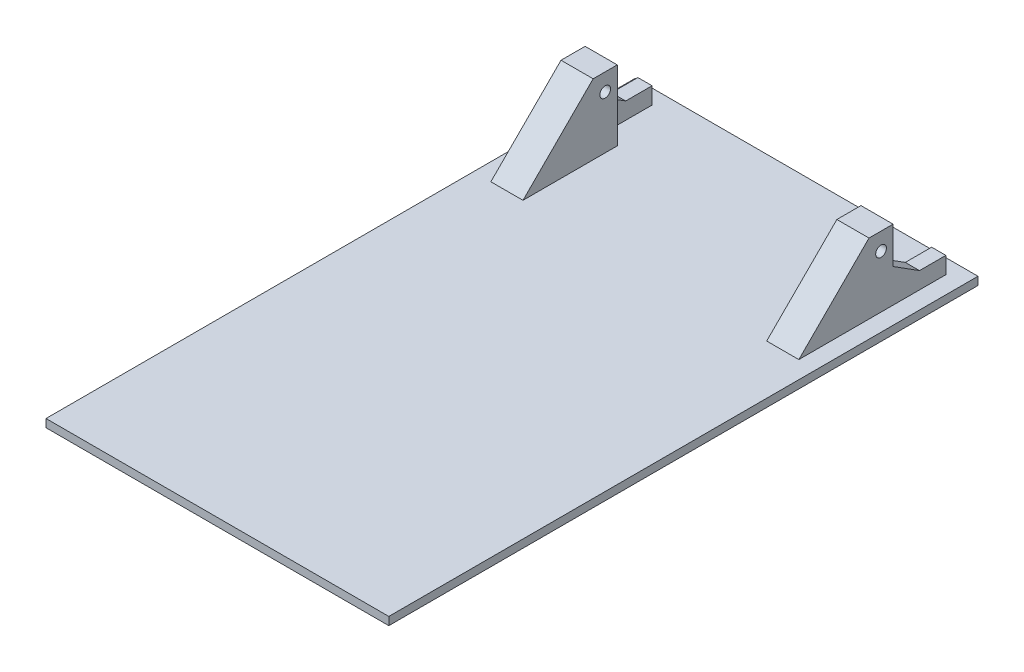
ISO-10303-21;
HEADER;
FILE_DESCRIPTION(('STEP AP214'),'2;1');
FILE_NAME('part.step','',(''),(''),'','','');
FILE_SCHEMA(('AUTOMOTIVE_DESIGN { 1 0 10303 214 1 1 1 1 }'));
ENDSEC;
DATA;
#1=APPLICATION_CONTEXT('core data for automotive mechanical design processes');
#2=APPLICATION_PROTOCOL_DEFINITION('international standard','automotive_design',2000,#1);
#3=PRODUCT_CONTEXT('',#1,'mechanical');
#4=PRODUCT('Part','Part','',(#3));
#5=PRODUCT_RELATED_PRODUCT_CATEGORY('part','',(#4));
#6=PRODUCT_DEFINITION_FORMATION('','',#4);
#7=PRODUCT_DEFINITION_CONTEXT('part definition',#1,'design');
#8=PRODUCT_DEFINITION('design','',#6,#7);
#9=PRODUCT_DEFINITION_SHAPE('','',#8);
#10=(LENGTH_UNIT() NAMED_UNIT(*) SI_UNIT(.MILLI.,.METRE.));
#11=(NAMED_UNIT(*) PLANE_ANGLE_UNIT() SI_UNIT($,.RADIAN.));
#12=(NAMED_UNIT(*) SI_UNIT($,.STERADIAN.) SOLID_ANGLE_UNIT());
#13=UNCERTAINTY_MEASURE_WITH_UNIT(LENGTH_MEASURE(1.E-05),#10,'distance_accuracy_value','');
#14=(GEOMETRIC_REPRESENTATION_CONTEXT(3) GLOBAL_UNCERTAINTY_ASSIGNED_CONTEXT((#13)) GLOBAL_UNIT_ASSIGNED_CONTEXT((#10,
#11,#12)) REPRESENTATION_CONTEXT('',''));
#15=CARTESIAN_POINT('',(0.,0.,0.));
#16=DIRECTION('',(0.,0.,1.));
#17=DIRECTION('',(1.,0.,0.));
#18=AXIS2_PLACEMENT_3D('',#15,#16,#17);
#19=CARTESIAN_POINT('',(0.,1.5,0.));
#20=DIRECTION('',(0.,1.,0.));
#21=DIRECTION('',(0.,0.,1.));
#22=AXIS2_PLACEMENT_3D('',#19,#20,#21);
#23=PLANE('',#22);
#24=DIRECTION('',(1.,0.,0.));
#25=VECTOR('',#24,1.);
#26=CARTESIAN_POINT('',(26.1,1.5,-24.7999999999997));
#27=LINE('',#26,#25);
#28=CARTESIAN_POINT('',(22.75,1.5,-24.7999999999997));
#29=VERTEX_POINT('',#28);
#30=CARTESIAN_POINT('',(28.75,1.5,-24.7999999999997));
#31=VERTEX_POINT('',#30);
#32=EDGE_CURVE('E223',#29,#31,#27,.T.);
#33=ORIENTED_EDGE('',*,*,#32,.F.);
#34=DIRECTION('',(0.,0.,-1.));
#35=VECTOR('',#34,1.);
#36=CARTESIAN_POINT('',(22.75,1.5,-37.9));
#37=LINE('',#36,#35);
#38=CARTESIAN_POINT('',(22.75,1.5,-42.4));
#39=VERTEX_POINT('',#38);
#40=EDGE_CURVE('E60',#29,#39,#37,.T.);
#41=ORIENTED_EDGE('',*,*,#40,.T.);
#42=DIRECTION('',(1.,0.,0.));
#43=VECTOR('',#42,1.);
#44=CARTESIAN_POINT('',(28.75,1.5,-42.4));
#45=LINE('',#44,#43);
#46=CARTESIAN_POINT('',(26.1,1.5,-42.4));
#47=VERTEX_POINT('',#46);
#48=EDGE_CURVE('E263',#39,#47,#45,.T.);
#49=ORIENTED_EDGE('',*,*,#48,.T.);
#50=DIRECTION('',(0.,0.,1.));
#51=VECTOR('',#50,1.);
#52=CARTESIAN_POINT('',(26.1000000000001,1.5,-52.2499999999998));
#53=LINE('',#52,#51);
#54=CARTESIAN_POINT('',(26.1000000000001,1.5,-52.2499999999998));
#55=VERTEX_POINT('',#54);
#56=EDGE_CURVE('E68',#55,#47,#53,.T.);
#57=ORIENTED_EDGE('',*,*,#56,.F.);
#58=DIRECTION('',(1.,0.,0.));
#59=VECTOR('',#58,1.);
#60=CARTESIAN_POINT('',(26.1000000000001,1.5,-52.2499999999998));
#61=LINE('',#60,#59);
#62=CARTESIAN_POINT('',(28.7500000000001,1.5,-52.2499999999998));
#63=VERTEX_POINT('',#62);
#64=EDGE_CURVE('E208',#55,#63,#61,.T.);
#65=ORIENTED_EDGE('',*,*,#64,.T.);
#66=DIRECTION('',(0.,0.,1.));
#67=VECTOR('',#66,1.);
#68=CARTESIAN_POINT('',(28.75,1.5,-42.4));
#69=LINE('',#68,#67);
#70=EDGE_CURVE('E233',#63,#31,#69,.T.);
#71=ORIENTED_EDGE('',*,*,#70,.T.);
#72=EDGE_LOOP('',(#33,#41,#49,#57,#65,#71));
#73=FACE_BOUND('',#72,.T.);
#74=DIRECTION('',(0.,0.,-1.));
#75=VECTOR('',#74,1.);
#76=CARTESIAN_POINT('',(32.,1.5,-55.));
#77=LINE('',#76,#75);
#78=CARTESIAN_POINT('',(32.,1.5,55.));
#79=VERTEX_POINT('',#78);
#80=CARTESIAN_POINT('',(32.,1.5,-55.));
#81=VERTEX_POINT('',#80);
#82=EDGE_CURVE('E370',#79,#81,#77,.T.);
#83=ORIENTED_EDGE('',*,*,#82,.T.);
#84=DIRECTION('',(-1.,0.,0.));
#85=VECTOR('',#84,1.);
#86=CARTESIAN_POINT('',(-32.,1.5,-55.));
#87=LINE('',#86,#85);
#88=CARTESIAN_POINT('',(-32.,1.5,-55.));
#89=VERTEX_POINT('',#88);
#90=EDGE_CURVE('E374',#81,#89,#87,.T.);
#91=ORIENTED_EDGE('',*,*,#90,.T.);
#92=DIRECTION('',(0.,0.,1.));
#93=VECTOR('',#92,1.);
#94=CARTESIAN_POINT('',(-32.,1.5,-55.));
#95=LINE('',#94,#93);
#96=CARTESIAN_POINT('',(-32.,1.5,55.));
#97=VERTEX_POINT('',#96);
#98=EDGE_CURVE('E378',#89,#97,#95,.T.);
#99=ORIENTED_EDGE('',*,*,#98,.T.);
#100=DIRECTION('',(1.,0.,0.));
#101=VECTOR('',#100,1.);
#102=CARTESIAN_POINT('',(-32.,1.5,55.));
#103=LINE('',#102,#101);
#104=EDGE_CURVE('E381',#97,#79,#103,.T.);
#105=ORIENTED_EDGE('',*,*,#104,.T.);
#106=EDGE_LOOP('',(#83,#91,#99,#105));
#107=FACE_BOUND('',#106,.T.);
#108=DIRECTION('',(0.,0.,-1.));
#109=VECTOR('',#108,1.);
#110=CARTESIAN_POINT('',(-22.75,1.5,-37.9));
#111=LINE('',#110,#109);
#112=CARTESIAN_POINT('',(-22.75,1.5,-24.7999999999997));
#113=VERTEX_POINT('',#112);
#114=CARTESIAN_POINT('',(-22.75,1.5,-42.4));
#115=VERTEX_POINT('',#114);
#116=EDGE_CURVE('E356',#113,#115,#111,.T.);
#117=ORIENTED_EDGE('',*,*,#116,.F.);
#118=DIRECTION('',(-1.,0.,0.));
#119=VECTOR('',#118,1.);
#120=CARTESIAN_POINT('',(-26.1,1.5,-24.7999999999997));
#121=LINE('',#120,#119);
#122=CARTESIAN_POINT('',(-28.75,1.5,-24.7999999999997));
#123=VERTEX_POINT('',#122);
#124=EDGE_CURVE('E285',#113,#123,#121,.T.);
#125=ORIENTED_EDGE('',*,*,#124,.T.);
#126=DIRECTION('',(0.,0.,1.));
#127=VECTOR('',#126,1.);
#128=CARTESIAN_POINT('',(-28.75,1.5,-42.4));
#129=LINE('',#128,#127);
#130=CARTESIAN_POINT('',(-28.7500000000001,1.5,-52.2499999999998));
#131=VERTEX_POINT('',#130);
#132=EDGE_CURVE('E323',#131,#123,#129,.T.);
#133=ORIENTED_EDGE('',*,*,#132,.F.);
#134=DIRECTION('',(-1.,0.,0.));
#135=VECTOR('',#134,1.);
#136=CARTESIAN_POINT('',(-26.1000000000001,1.5,-52.2499999999998));
#137=LINE('',#136,#135);
#138=CARTESIAN_POINT('',(-26.1000000000001,1.5,-52.2499999999998));
#139=VERTEX_POINT('',#138);
#140=EDGE_CURVE('E319',#139,#131,#137,.T.);
#141=ORIENTED_EDGE('',*,*,#140,.F.);
#142=DIRECTION('',(0.,0.,1.));
#143=VECTOR('',#142,1.);
#144=CARTESIAN_POINT('',(-26.1000000000001,1.5,-52.2499999999998));
#145=LINE('',#144,#143);
#146=CARTESIAN_POINT('',(-26.1,1.5,-42.4));
#147=VERTEX_POINT('',#146);
#148=EDGE_CURVE('E302',#139,#147,#145,.T.);
#149=ORIENTED_EDGE('',*,*,#148,.T.);
#150=DIRECTION('',(-1.,0.,0.));
#151=VECTOR('',#150,1.);
#152=CARTESIAN_POINT('',(-28.75,1.5,-42.4));
#153=LINE('',#152,#151);
#154=EDGE_CURVE('E344',#115,#147,#153,.T.);
#155=ORIENTED_EDGE('',*,*,#154,.F.);
#156=EDGE_LOOP('',(#117,#125,#133,#141,#149,#155));
#157=FACE_BOUND('',#156,.T.);
#158=ADVANCED_FACE('F44',(#73,#107,#157),#23,.T.);
#159=CARTESIAN_POINT('',(28.75,14.6,-42.4));
#160=DIRECTION('',(0.,0.,-1.));
#161=DIRECTION('',(-1.,0.,0.));
#162=AXIS2_PLACEMENT_3D('',#159,#160,#161);
#163=PLANE('',#162);
#164=DIRECTION('',(0.,-1.,0.));
#165=VECTOR('',#164,1.);
#166=CARTESIAN_POINT('',(28.75,14.6,-42.4));
#167=LINE('',#166,#165);
#168=CARTESIAN_POINT('',(28.75,14.6,-42.4));
#169=VERTEX_POINT('',#168);
#170=CARTESIAN_POINT('',(28.75,7.75,-42.4));
#171=VERTEX_POINT('',#170);
#172=EDGE_CURVE('E270',#169,#171,#167,.T.);
#173=ORIENTED_EDGE('',*,*,#172,.T.);
#174=DIRECTION('',(1.,0.,0.));
#175=VECTOR('',#174,1.);
#176=CARTESIAN_POINT('',(26.1,7.75,-42.4));
#177=LINE('',#176,#175);
#178=CARTESIAN_POINT('',(26.1,7.75,-42.4));
#179=VERTEX_POINT('',#178);
#180=EDGE_CURVE('E229',#179,#171,#177,.T.);
#181=ORIENTED_EDGE('',*,*,#180,.F.);
#182=DIRECTION('',(0.,1.,0.));
#183=VECTOR('',#182,1.);
#184=CARTESIAN_POINT('',(26.1,1.5,-42.4));
#185=LINE('',#184,#183);
#186=EDGE_CURVE('E214',#47,#179,#185,.T.);
#187=ORIENTED_EDGE('',*,*,#186,.F.);
#188=ORIENTED_EDGE('',*,*,#48,.F.);
#189=DIRECTION('',(0.,-1.,0.));
#190=VECTOR('',#189,1.);
#191=CARTESIAN_POINT('',(22.75,14.6,-42.4));
#192=LINE('',#191,#190);
#193=CARTESIAN_POINT('',(22.75,14.6,-42.4));
#194=VERTEX_POINT('',#193);
#195=EDGE_CURVE('E260',#194,#39,#192,.T.);
#196=ORIENTED_EDGE('',*,*,#195,.F.);
#197=DIRECTION('',(1.,0.,0.));
#198=VECTOR('',#197,1.);
#199=CARTESIAN_POINT('',(28.75,14.6,-42.4));
#200=LINE('',#199,#198);
#201=EDGE_CURVE('E249',#194,#169,#200,.T.);
#202=ORIENTED_EDGE('',*,*,#201,.T.);
#203=EDGE_LOOP('',(#173,#181,#187,#188,#196,#202));
#204=FACE_BOUND('',#203,.T.);
#205=ADVANCED_FACE('F431',(#204),#163,.T.);
#206=CARTESIAN_POINT('',(32.,1.5,-55.));
#207=DIRECTION('',(-1.,0.,0.));
#208=DIRECTION('',(0.,0.,1.));
#209=AXIS2_PLACEMENT_3D('',#206,#207,#208);
#210=PLANE('',#209);
#211=DIRECTION('',(0.,0.,-1.));
#212=VECTOR('',#211,1.);
#213=CARTESIAN_POINT('',(32.,0.,-55.));
#214=LINE('',#213,#212);
#215=CARTESIAN_POINT('',(32.,0.,55.));
#216=VERTEX_POINT('',#215);
#217=CARTESIAN_POINT('',(32.,0.,-55.));
#218=VERTEX_POINT('',#217);
#219=EDGE_CURVE('E369',#216,#218,#214,.T.);
#220=ORIENTED_EDGE('',*,*,#219,.T.);
#221=DIRECTION('',(0.,-1.,0.));
#222=VECTOR('',#221,1.);
#223=CARTESIAN_POINT('',(32.,1.5,-55.));
#224=LINE('',#223,#222);
#225=EDGE_CURVE('E11',#81,#218,#224,.T.);
#226=ORIENTED_EDGE('',*,*,#225,.F.);
#227=ORIENTED_EDGE('',*,*,#82,.F.);
#228=DIRECTION('',(0.,-1.,0.));
#229=VECTOR('',#228,1.);
#230=CARTESIAN_POINT('',(32.,1.5,55.));
#231=LINE('',#230,#229);
#232=EDGE_CURVE('E384',#79,#216,#231,.T.);
#233=ORIENTED_EDGE('',*,*,#232,.T.);
#234=EDGE_LOOP('',(#220,#226,#227,#233));
#235=FACE_BOUND('',#234,.T.);
#236=ADVANCED_FACE('F46',(#235),#210,.F.);
#237=CARTESIAN_POINT('',(-32.,1.5,-55.));
#238=DIRECTION('',(0.,0.,1.));
#239=DIRECTION('',(1.,0.,0.));
#240=AXIS2_PLACEMENT_3D('',#237,#238,#239);
#241=PLANE('',#240);
#242=DIRECTION('',(-1.,0.,0.));
#243=VECTOR('',#242,1.);
#244=CARTESIAN_POINT('',(-32.,0.,-55.));
#245=LINE('',#244,#243);
#246=CARTESIAN_POINT('',(-32.,0.,-55.));
#247=VERTEX_POINT('',#246);
#248=EDGE_CURVE('E388',#218,#247,#245,.T.);
#249=ORIENTED_EDGE('',*,*,#248,.T.);
#250=DIRECTION('',(0.,-1.,0.));
#251=VECTOR('',#250,1.);
#252=CARTESIAN_POINT('',(-32.,1.5,-55.));
#253=LINE('',#252,#251);
#254=EDGE_CURVE('E53',#89,#247,#253,.T.);
#255=ORIENTED_EDGE('',*,*,#254,.F.);
#256=ORIENTED_EDGE('',*,*,#90,.F.);
#257=ORIENTED_EDGE('',*,*,#225,.T.);
#258=EDGE_LOOP('',(#249,#255,#256,#257));
#259=FACE_BOUND('',#258,.T.);
#260=ADVANCED_FACE('F424',(#259),#241,.F.);
#261=CARTESIAN_POINT('',(-32.,1.5,-55.));
#262=DIRECTION('',(1.,0.,0.));
#263=DIRECTION('',(0.,0.,-1.));
#264=AXIS2_PLACEMENT_3D('',#261,#262,#263);
#265=PLANE('',#264);
#266=DIRECTION('',(0.,0.,1.));
#267=VECTOR('',#266,1.);
#268=CARTESIAN_POINT('',(-32.,0.,-55.));
#269=LINE('',#268,#267);
#270=CARTESIAN_POINT('',(-32.,0.,55.));
#271=VERTEX_POINT('',#270);
#272=EDGE_CURVE('E391',#247,#271,#269,.T.);
#273=ORIENTED_EDGE('',*,*,#272,.T.);
#274=DIRECTION('',(0.,-1.,0.));
#275=VECTOR('',#274,1.);
#276=CARTESIAN_POINT('',(-32.,1.5,55.));
#277=LINE('',#276,#275);
#278=EDGE_CURVE('E399',#97,#271,#277,.T.);
#279=ORIENTED_EDGE('',*,*,#278,.F.);
#280=ORIENTED_EDGE('',*,*,#98,.F.);
#281=ORIENTED_EDGE('',*,*,#254,.T.);
#282=EDGE_LOOP('',(#273,#279,#280,#281));
#283=FACE_BOUND('',#282,.T.);
#284=ADVANCED_FACE('F408',(#283),#265,.F.);
#285=CARTESIAN_POINT('',(-32.,1.5,55.));
#286=DIRECTION('',(0.,0.,-1.));
#287=DIRECTION('',(-1.,0.,0.));
#288=AXIS2_PLACEMENT_3D('',#285,#286,#287);
#289=PLANE('',#288);
#290=DIRECTION('',(1.,0.,0.));
#291=VECTOR('',#290,1.);
#292=CARTESIAN_POINT('',(-32.,0.,55.));
#293=LINE('',#292,#291);
#294=EDGE_CURVE('E375',#271,#216,#293,.T.);
#295=ORIENTED_EDGE('',*,*,#294,.T.);
#296=ORIENTED_EDGE('',*,*,#232,.F.);
#297=ORIENTED_EDGE('',*,*,#104,.F.);
#298=ORIENTED_EDGE('',*,*,#278,.T.);
#299=EDGE_LOOP('',(#295,#296,#297,#298));
#300=FACE_BOUND('',#299,.T.);
#301=ADVANCED_FACE('F417',(#300),#289,.F.);
#302=CARTESIAN_POINT('',(0.,0.,0.));
#303=DIRECTION('',(0.,1.,0.));
#304=DIRECTION('',(0.,0.,1.));
#305=AXIS2_PLACEMENT_3D('',#302,#303,#304);
#306=PLANE('',#305);
#307=ORIENTED_EDGE('',*,*,#219,.F.);
#308=ORIENTED_EDGE('',*,*,#294,.F.);
#309=ORIENTED_EDGE('',*,*,#272,.F.);
#310=ORIENTED_EDGE('',*,*,#248,.F.);
#311=EDGE_LOOP('',(#307,#308,#309,#310));
#312=FACE_BOUND('',#311,.T.);
#313=ADVANCED_FACE('F414',(#312),#306,.F.);
#314=CARTESIAN_POINT('',(-28.75,14.6,-42.4));
#315=DIRECTION('',(1.,0.,0.));
#316=DIRECTION('',(0.,0.,-1.));
#317=AXIS2_PLACEMENT_3D('',#314,#315,#316);
#318=PLANE('',#317);
#319=CARTESIAN_POINT('',(-28.75,11.35,-40.15));
#320=DIRECTION('',(-1.,0.,0.));
#321=DIRECTION('',(0.,0.,1.));
#322=AXIS2_PLACEMENT_3D('',#319,#320,#321);
#323=CIRCLE('',#322,0.999999999999998);
#324=CARTESIAN_POINT('',(-28.75,11.35,-39.15));
#325=VERTEX_POINT('',#324);
#326=EDGE_CURVE('E273',#325,#325,#323,.T.);
#327=ORIENTED_EDGE('',*,*,#326,.F.);
#328=EDGE_LOOP('',(#327));
#329=FACE_BOUND('',#328,.T.);
#330=ORIENTED_EDGE('',*,*,#132,.T.);
#331=DIRECTION('',(0.,0.707106781186539,-0.707106781186556));
#332=VECTOR('',#331,1.);
#333=CARTESIAN_POINT('',(-28.75,14.6,-37.9));
#334=LINE('',#333,#332);
#335=CARTESIAN_POINT('',(-28.75,14.6,-37.9));
#336=VERTEX_POINT('',#335);
#337=EDGE_CURVE('E312',#123,#336,#334,.T.);
#338=ORIENTED_EDGE('',*,*,#337,.T.);
#339=DIRECTION('',(0.,0.,1.));
#340=VECTOR('',#339,1.);
#341=CARTESIAN_POINT('',(-28.75,14.6,-42.4));
#342=LINE('',#341,#340);
#343=CARTESIAN_POINT('',(-28.75,14.6,-42.4));
#344=VERTEX_POINT('',#343);
#345=EDGE_CURVE('E339',#344,#336,#342,.T.);
#346=ORIENTED_EDGE('',*,*,#345,.F.);
#347=DIRECTION('',(0.,-1.,0.));
#348=VECTOR('',#347,1.);
#349=CARTESIAN_POINT('',(-28.75,14.6,-42.4));
#350=LINE('',#349,#348);
#351=CARTESIAN_POINT('',(-28.75,7.75,-42.4));
#352=VERTEX_POINT('',#351);
#353=EDGE_CURVE('E353',#344,#352,#350,.T.);
#354=ORIENTED_EDGE('',*,*,#353,.T.);
#355=DIRECTION('',(0.,-0.535765677948249,-0.844366708446427));
#356=VECTOR('',#355,1.);
#357=CARTESIAN_POINT('',(-28.75,7.75,-42.4));
#358=LINE('',#357,#356);
#359=CARTESIAN_POINT('',(-28.75,4.625,-47.3249999999999));
#360=VERTEX_POINT('',#359);
#361=EDGE_CURVE('E307',#352,#360,#358,.T.);
#362=ORIENTED_EDGE('',*,*,#361,.T.);
#363=DIRECTION('',(0.,0.,-1.));
#364=VECTOR('',#363,1.);
#365=CARTESIAN_POINT('',(-28.75,4.625,-47.3249999999999));
#366=LINE('',#365,#364);
#367=CARTESIAN_POINT('',(-28.7500000000001,4.625,-52.2499999999998));
#368=VERTEX_POINT('',#367);
#369=EDGE_CURVE('E311',#360,#368,#366,.T.);
#370=ORIENTED_EDGE('',*,*,#369,.T.);
#371=DIRECTION('',(0.,-1.,0.));
#372=VECTOR('',#371,1.);
#373=CARTESIAN_POINT('',(-28.7500000000001,4.625,-52.2499999999998));
#374=LINE('',#373,#372);
#375=EDGE_CURVE('E291',#368,#131,#374,.T.);
#376=ORIENTED_EDGE('',*,*,#375,.T.);
#377=EDGE_LOOP('',(#330,#338,#346,#354,#362,#370,#376));
#378=FACE_BOUND('',#377,.T.);
#379=ADVANCED_FACE('F442',(#329,#378),#318,.F.);
#380=CARTESIAN_POINT('',(-22.75,14.6,-37.9));
#381=DIRECTION('',(-1.,0.,0.));
#382=DIRECTION('',(0.,0.,1.));
#383=AXIS2_PLACEMENT_3D('',#380,#381,#382);
#384=PLANE('',#383);
#385=CARTESIAN_POINT('',(-22.75,11.35,-40.15));
#386=DIRECTION('',(-1.,0.,0.));
#387=DIRECTION('',(0.,0.,1.));
#388=AXIS2_PLACEMENT_3D('',#385,#386,#387);
#389=CIRCLE('',#388,0.999999999999998);
#390=CARTESIAN_POINT('',(-22.75,11.35,-39.15));
#391=VERTEX_POINT('',#390);
#392=EDGE_CURVE('E277',#391,#391,#389,.F.);
#393=ORIENTED_EDGE('',*,*,#392,.F.);
#394=EDGE_LOOP('',(#393));
#395=FACE_BOUND('',#394,.T.);
#396=ORIENTED_EDGE('',*,*,#116,.T.);
#397=DIRECTION('',(0.,-1.,0.));
#398=VECTOR('',#397,1.);
#399=CARTESIAN_POINT('',(-22.75,14.6,-42.4));
#400=LINE('',#399,#398);
#401=CARTESIAN_POINT('',(-22.75,14.6,-42.4));
#402=VERTEX_POINT('',#401);
#403=EDGE_CURVE('E366',#402,#115,#400,.T.);
#404=ORIENTED_EDGE('',*,*,#403,.F.);
#405=DIRECTION('',(0.,0.,-1.));
#406=VECTOR('',#405,1.);
#407=CARTESIAN_POINT('',(-22.75,14.6,-37.9));
#408=LINE('',#407,#406);
#409=CARTESIAN_POINT('',(-22.75,14.6,-37.9));
#410=VERTEX_POINT('',#409);
#411=EDGE_CURVE('E347',#410,#402,#408,.T.);
#412=ORIENTED_EDGE('',*,*,#411,.F.);
#413=DIRECTION('',(0.,0.707106781186539,-0.707106781186556));
#414=VECTOR('',#413,1.);
#415=CARTESIAN_POINT('',(-22.75,14.6,-37.9));
#416=LINE('',#415,#414);
#417=EDGE_CURVE('E281',#113,#410,#416,.T.);
#418=ORIENTED_EDGE('',*,*,#417,.F.);
#419=EDGE_LOOP('',(#396,#404,#412,#418));
#420=FACE_BOUND('',#419,.T.);
#421=ADVANCED_FACE('F466',(#395,#420),#384,.F.);
#422=CARTESIAN_POINT('',(-28.75,14.6,-42.4));
#423=DIRECTION('',(0.,0.,1.));
#424=DIRECTION('',(1.,0.,0.));
#425=AXIS2_PLACEMENT_3D('',#422,#423,#424);
#426=PLANE('',#425);
#427=DIRECTION('',(0.,1.,0.));
#428=VECTOR('',#427,1.);
#429=CARTESIAN_POINT('',(-26.1,1.5,-42.4));
#430=LINE('',#429,#428);
#431=CARTESIAN_POINT('',(-26.1,7.75,-42.4));
#432=VERTEX_POINT('',#431);
#433=EDGE_CURVE('E286',#147,#432,#430,.T.);
#434=ORIENTED_EDGE('',*,*,#433,.T.);
#435=DIRECTION('',(-1.,0.,0.));
#436=VECTOR('',#435,1.);
#437=CARTESIAN_POINT('',(-26.1,7.75,-42.4));
#438=LINE('',#437,#436);
#439=EDGE_CURVE('E306',#432,#352,#438,.T.);
#440=ORIENTED_EDGE('',*,*,#439,.T.);
#441=ORIENTED_EDGE('',*,*,#353,.F.);
#442=DIRECTION('',(-1.,0.,0.));
#443=VECTOR('',#442,1.);
#444=CARTESIAN_POINT('',(-28.75,14.6,-42.4));
#445=LINE('',#444,#443);
#446=EDGE_CURVE('E350',#402,#344,#445,.T.);
#447=ORIENTED_EDGE('',*,*,#446,.F.);
#448=ORIENTED_EDGE('',*,*,#403,.T.);
#449=ORIENTED_EDGE('',*,*,#154,.T.);
#450=EDGE_LOOP('',(#434,#440,#441,#447,#448,#449));
#451=FACE_BOUND('',#450,.T.);
#452=ADVANCED_FACE('F461',(#451),#426,.F.);
#453=CARTESIAN_POINT('',(0.,14.6,0.));
#454=DIRECTION('',(0.,1.,0.));
#455=DIRECTION('',(0.,0.,1.));
#456=AXIS2_PLACEMENT_3D('',#453,#454,#455);
#457=PLANE('',#456);
#458=ORIENTED_EDGE('',*,*,#345,.T.);
#459=DIRECTION('',(1.,0.,0.));
#460=VECTOR('',#459,1.);
#461=CARTESIAN_POINT('',(-28.75,14.6,-37.9));
#462=LINE('',#461,#460);
#463=EDGE_CURVE('E343',#336,#410,#462,.T.);
#464=ORIENTED_EDGE('',*,*,#463,.T.);
#465=ORIENTED_EDGE('',*,*,#411,.T.);
#466=ORIENTED_EDGE('',*,*,#446,.T.);
#467=EDGE_LOOP('',(#458,#464,#465,#466));
#468=FACE_BOUND('',#467,.T.);
#469=ADVANCED_FACE('F465',(#468),#457,.T.);
#470=CARTESIAN_POINT('',(-26.1,14.6,-37.9));
#471=DIRECTION('',(0.,0.707106781186556,0.707106781186539));
#472=DIRECTION('',(0.,-0.707106781186539,0.707106781186556));
#473=AXIS2_PLACEMENT_3D('',#470,#471,#472);
#474=PLANE('',#473);
#475=ORIENTED_EDGE('',*,*,#337,.F.);
#476=ORIENTED_EDGE('',*,*,#124,.F.);
#477=ORIENTED_EDGE('',*,*,#417,.T.);
#478=ORIENTED_EDGE('',*,*,#463,.F.);
#479=EDGE_LOOP('',(#475,#476,#477,#478));
#480=FACE_BOUND('',#479,.T.);
#481=ADVANCED_FACE('F479',(#480),#474,.T.);
#482=CARTESIAN_POINT('',(-26.1000000000001,4.625,-52.2499999999998));
#483=DIRECTION('',(0.,0.,-1.));
#484=DIRECTION('',(-1.,0.,0.));
#485=AXIS2_PLACEMENT_3D('',#482,#483,#484);
#486=PLANE('',#485);
#487=ORIENTED_EDGE('',*,*,#375,.F.);
#488=DIRECTION('',(-1.,0.,0.));
#489=VECTOR('',#488,1.);
#490=CARTESIAN_POINT('',(-26.1000000000001,4.625,-52.2499999999998));
#491=LINE('',#490,#489);
#492=CARTESIAN_POINT('',(-26.1000000000001,4.625,-52.2499999999998));
#493=VERTEX_POINT('',#492);
#494=EDGE_CURVE('E324',#493,#368,#491,.T.);
#495=ORIENTED_EDGE('',*,*,#494,.F.);
#496=DIRECTION('',(0.,-1.,0.));
#497=VECTOR('',#496,1.);
#498=CARTESIAN_POINT('',(-26.1000000000001,4.625,-52.2499999999998));
#499=LINE('',#498,#497);
#500=EDGE_CURVE('E299',#493,#139,#499,.T.);
#501=ORIENTED_EDGE('',*,*,#500,.T.);
#502=ORIENTED_EDGE('',*,*,#140,.T.);
#503=EDGE_LOOP('',(#487,#495,#501,#502));
#504=FACE_BOUND('',#503,.T.);
#505=ADVANCED_FACE('F474',(#504),#486,.T.);
#506=CARTESIAN_POINT('',(-26.1000000000001,4.625,-47.3249999999999));
#507=DIRECTION('',(0.,1.,0.));
#508=DIRECTION('',(0.,0.,1.));
#509=AXIS2_PLACEMENT_3D('',#506,#507,#508);
#510=PLANE('',#509);
#511=ORIENTED_EDGE('',*,*,#369,.F.);
#512=DIRECTION('',(-1.,0.,0.));
#513=VECTOR('',#512,1.);
#514=CARTESIAN_POINT('',(-26.1000000000001,4.625,-47.3249999999999));
#515=LINE('',#514,#513);
#516=CARTESIAN_POINT('',(-26.1000000000001,4.625,-47.3249999999999));
#517=VERTEX_POINT('',#516);
#518=EDGE_CURVE('E327',#517,#360,#515,.T.);
#519=ORIENTED_EDGE('',*,*,#518,.F.);
#520=DIRECTION('',(0.,0.,-1.));
#521=VECTOR('',#520,1.);
#522=CARTESIAN_POINT('',(-26.1000000000001,4.625,-47.3249999999999));
#523=LINE('',#522,#521);
#524=EDGE_CURVE('E295',#517,#493,#523,.T.);
#525=ORIENTED_EDGE('',*,*,#524,.T.);
#526=ORIENTED_EDGE('',*,*,#494,.T.);
#527=EDGE_LOOP('',(#511,#519,#525,#526));
#528=FACE_BOUND('',#527,.T.);
#529=ADVANCED_FACE('F478',(#528),#510,.T.);
#530=CARTESIAN_POINT('',(-26.1,7.75,-42.4));
#531=DIRECTION('',(0.,0.844366708446427,-0.535765677948249));
#532=DIRECTION('',(0.,0.535765677948249,0.844366708446427));
#533=AXIS2_PLACEMENT_3D('',#530,#531,#532);
#534=PLANE('',#533);
#535=ORIENTED_EDGE('',*,*,#361,.F.);
#536=ORIENTED_EDGE('',*,*,#439,.F.);
#537=DIRECTION('',(0.,-0.535765677948249,-0.844366708446427));
#538=VECTOR('',#537,1.);
#539=CARTESIAN_POINT('',(-26.1,7.75,-42.4));
#540=LINE('',#539,#538);
#541=EDGE_CURVE('E290',#432,#517,#540,.T.);
#542=ORIENTED_EDGE('',*,*,#541,.T.);
#543=ORIENTED_EDGE('',*,*,#518,.T.);
#544=EDGE_LOOP('',(#535,#536,#542,#543));
#545=FACE_BOUND('',#544,.T.);
#546=ADVANCED_FACE('F489',(#545),#534,.T.);
#547=CARTESIAN_POINT('',(-26.1,0.,0.));
#548=DIRECTION('',(-1.,0.,0.));
#549=DIRECTION('',(0.,0.,1.));
#550=AXIS2_PLACEMENT_3D('',#547,#548,#549);
#551=PLANE('',#550);
#552=ORIENTED_EDGE('',*,*,#433,.F.);
#553=ORIENTED_EDGE('',*,*,#148,.F.);
#554=ORIENTED_EDGE('',*,*,#500,.F.);
#555=ORIENTED_EDGE('',*,*,#524,.F.);
#556=ORIENTED_EDGE('',*,*,#541,.F.);
#557=EDGE_LOOP('',(#552,#553,#554,#555,#556));
#558=FACE_BOUND('',#557,.T.);
#559=ADVANCED_FACE('F498',(#558),#551,.F.);
#560=CARTESIAN_POINT('',(-19.9215728752538,11.35,-40.15));
#561=DIRECTION('',(-1.,0.,0.));
#562=DIRECTION('',(0.,0.,1.));
#563=AXIS2_PLACEMENT_3D('',#560,#561,#562);
#564=CYLINDRICAL_SURFACE('',#563,0.999999999999998);
#565=ORIENTED_EDGE('',*,*,#392,.T.);
#566=EDGE_LOOP('',(#565));
#567=FACE_BOUND('',#566,.T.);
#568=ORIENTED_EDGE('',*,*,#326,.T.);
#569=EDGE_LOOP('',(#568));
#570=FACE_BOUND('',#569,.T.);
#571=ADVANCED_FACE('F507',(#567,#570),#564,.F.);
#572=CARTESIAN_POINT('',(28.75,14.6,-42.4));
#573=DIRECTION('',(1.,0.,0.));
#574=DIRECTION('',(0.,0.,-1.));
#575=AXIS2_PLACEMENT_3D('',#572,#573,#574);
#576=PLANE('',#575);
#577=CARTESIAN_POINT('',(28.75,11.35,-40.15));
#578=DIRECTION('',(-1.,0.,0.));
#579=DIRECTION('',(0.,0.,1.));
#580=AXIS2_PLACEMENT_3D('',#577,#578,#579);
#581=CIRCLE('',#580,0.999999999999998);
#582=CARTESIAN_POINT('',(28.75,11.35,-41.15));
#583=VERTEX_POINT('',#582);
#584=EDGE_CURVE('E653',#583,#583,#581,.T.);
#585=ORIENTED_EDGE('',*,*,#584,.T.);
#586=EDGE_LOOP('',(#585));
#587=FACE_BOUND('',#586,.T.);
#588=ORIENTED_EDGE('',*,*,#70,.F.);
#589=DIRECTION('',(0.,-1.,0.));
#590=VECTOR('',#589,1.);
#591=CARTESIAN_POINT('',(28.7500000000001,4.625,-52.2499999999998));
#592=LINE('',#591,#590);
#593=CARTESIAN_POINT('',(28.7500000000001,4.625,-52.2499999999998));
#594=VERTEX_POINT('',#593);
#595=EDGE_CURVE('E220',#594,#63,#592,.T.);
#596=ORIENTED_EDGE('',*,*,#595,.F.);
#597=DIRECTION('',(0.,0.,-1.));
#598=VECTOR('',#597,1.);
#599=CARTESIAN_POINT('',(28.75,4.625,-47.3249999999999));
#600=LINE('',#599,#598);
#601=CARTESIAN_POINT('',(28.75,4.625,-47.3249999999999));
#602=VERTEX_POINT('',#601);
#603=EDGE_CURVE('E202',#602,#594,#600,.T.);
#604=ORIENTED_EDGE('',*,*,#603,.F.);
#605=DIRECTION('',(0.,-0.535765677948249,-0.844366708446427));
#606=VECTOR('',#605,1.);
#607=CARTESIAN_POINT('',(28.75,7.75,-42.4));
#608=LINE('',#607,#606);
#609=EDGE_CURVE('E226',#171,#602,#608,.T.);
#610=ORIENTED_EDGE('',*,*,#609,.F.);
#611=ORIENTED_EDGE('',*,*,#172,.F.);
#612=DIRECTION('',(0.,0.,1.));
#613=VECTOR('',#612,1.);
#614=CARTESIAN_POINT('',(28.75,14.6,-42.4));
#615=LINE('',#614,#613);
#616=CARTESIAN_POINT('',(28.75,14.6,-37.9));
#617=VERTEX_POINT('',#616);
#618=EDGE_CURVE('E246',#169,#617,#615,.T.);
#619=ORIENTED_EDGE('',*,*,#618,.T.);
#620=DIRECTION('',(0.,0.707106781186539,-0.707106781186556));
#621=VECTOR('',#620,1.);
#622=CARTESIAN_POINT('',(28.75,14.6,-37.9));
#623=LINE('',#622,#621);
#624=EDGE_CURVE('E238',#31,#617,#623,.T.);
#625=ORIENTED_EDGE('',*,*,#624,.F.);
#626=EDGE_LOOP('',(#588,#596,#604,#610,#611,#619,#625));
#627=FACE_BOUND('',#626,.T.);
#628=ADVANCED_FACE('F541',(#587,#627),#576,.T.);
#629=CARTESIAN_POINT('',(22.75,14.6,-37.9));
#630=DIRECTION('',(-1.,0.,0.));
#631=DIRECTION('',(0.,0.,1.));
#632=AXIS2_PLACEMENT_3D('',#629,#630,#631);
#633=PLANE('',#632);
#634=CARTESIAN_POINT('',(22.75,11.35,-40.15));
#635=DIRECTION('',(1.,0.,0.));
#636=DIRECTION('',(0.,0.,-1.));
#637=AXIS2_PLACEMENT_3D('',#634,#635,#636);
#638=CIRCLE('',#637,0.999999999999998);
#639=CARTESIAN_POINT('',(22.75,11.35,-41.15));
#640=VERTEX_POINT('',#639);
#641=EDGE_CURVE('E650',#640,#640,#638,.T.);
#642=ORIENTED_EDGE('',*,*,#641,.T.);
#643=EDGE_LOOP('',(#642));
#644=FACE_BOUND('',#643,.T.);
#645=ORIENTED_EDGE('',*,*,#40,.F.);
#646=DIRECTION('',(0.,0.707106781186539,-0.707106781186556));
#647=VECTOR('',#646,1.);
#648=CARTESIAN_POINT('',(22.75,14.6,-37.9));
#649=LINE('',#648,#647);
#650=CARTESIAN_POINT('',(22.75,14.6,-37.9));
#651=VERTEX_POINT('',#650);
#652=EDGE_CURVE('E242',#29,#651,#649,.T.);
#653=ORIENTED_EDGE('',*,*,#652,.T.);
#654=DIRECTION('',(0.,0.,-1.));
#655=VECTOR('',#654,1.);
#656=CARTESIAN_POINT('',(22.75,14.6,-37.9));
#657=LINE('',#656,#655);
#658=EDGE_CURVE('E253',#651,#194,#657,.T.);
#659=ORIENTED_EDGE('',*,*,#658,.T.);
#660=ORIENTED_EDGE('',*,*,#195,.T.);
#661=EDGE_LOOP('',(#645,#653,#659,#660));
#662=FACE_BOUND('',#661,.T.);
#663=ADVANCED_FACE('F555',(#644,#662),#633,.T.);
#664=CARTESIAN_POINT('',(0.,14.6,0.));
#665=DIRECTION('',(0.,1.,0.));
#666=DIRECTION('',(0.,0.,1.));
#667=AXIS2_PLACEMENT_3D('',#664,#665,#666);
#668=PLANE('',#667);
#669=ORIENTED_EDGE('',*,*,#618,.F.);
#670=ORIENTED_EDGE('',*,*,#201,.F.);
#671=ORIENTED_EDGE('',*,*,#658,.F.);
#672=DIRECTION('',(-1.,0.,0.));
#673=VECTOR('',#672,1.);
#674=CARTESIAN_POINT('',(28.75,14.6,-37.9));
#675=LINE('',#674,#673);
#676=EDGE_CURVE('E257',#617,#651,#675,.T.);
#677=ORIENTED_EDGE('',*,*,#676,.F.);
#678=EDGE_LOOP('',(#669,#670,#671,#677));
#679=FACE_BOUND('',#678,.T.);
#680=ADVANCED_FACE('F568',(#679),#668,.T.);
#681=CARTESIAN_POINT('',(26.1,14.6,-37.9));
#682=DIRECTION('',(0.,-0.707106781186556,-0.707106781186539));
#683=DIRECTION('',(0.,0.707106781186539,-0.707106781186556));
#684=AXIS2_PLACEMENT_3D('',#681,#682,#683);
#685=PLANE('',#684);
#686=ORIENTED_EDGE('',*,*,#624,.T.);
#687=ORIENTED_EDGE('',*,*,#676,.T.);
#688=ORIENTED_EDGE('',*,*,#652,.F.);
#689=ORIENTED_EDGE('',*,*,#32,.T.);
#690=EDGE_LOOP('',(#686,#687,#688,#689));
#691=FACE_BOUND('',#690,.T.);
#692=ADVANCED_FACE('F581',(#691),#685,.F.);
#693=CARTESIAN_POINT('',(26.1,7.75,-42.4));
#694=DIRECTION('',(0.,-0.844366708446427,0.535765677948249));
#695=DIRECTION('',(0.,-0.535765677948249,-0.844366708446427));
#696=AXIS2_PLACEMENT_3D('',#693,#694,#695);
#697=PLANE('',#696);
#698=ORIENTED_EDGE('',*,*,#609,.T.);
#699=DIRECTION('',(1.,0.,0.));
#700=VECTOR('',#699,1.);
#701=CARTESIAN_POINT('',(26.1000000000001,4.625,-47.3249999999999));
#702=LINE('',#701,#700);
#703=CARTESIAN_POINT('',(26.1000000000001,4.625,-47.3249999999999));
#704=VERTEX_POINT('',#703);
#705=EDGE_CURVE('E207',#704,#602,#702,.T.);
#706=ORIENTED_EDGE('',*,*,#705,.F.);
#707=DIRECTION('',(0.,-0.535765677948249,-0.844366708446427));
#708=VECTOR('',#707,1.);
#709=CARTESIAN_POINT('',(26.1,7.75,-42.4));
#710=LINE('',#709,#708);
#711=EDGE_CURVE('E192',#179,#704,#710,.T.);
#712=ORIENTED_EDGE('',*,*,#711,.F.);
#713=ORIENTED_EDGE('',*,*,#180,.T.);
#714=EDGE_LOOP('',(#698,#706,#712,#713));
#715=FACE_BOUND('',#714,.T.);
#716=ADVANCED_FACE('F598',(#715),#697,.F.);
#717=CARTESIAN_POINT('',(26.1000000000001,4.625,-47.3249999999999));
#718=DIRECTION('',(0.,-1.,0.));
#719=DIRECTION('',(0.,0.,-1.));
#720=AXIS2_PLACEMENT_3D('',#717,#718,#719);
#721=PLANE('',#720);
#722=ORIENTED_EDGE('',*,*,#603,.T.);
#723=DIRECTION('',(1.,0.,0.));
#724=VECTOR('',#723,1.);
#725=CARTESIAN_POINT('',(26.1000000000001,4.625,-52.2499999999998));
#726=LINE('',#725,#724);
#727=CARTESIAN_POINT('',(26.1000000000001,4.625,-52.2499999999998));
#728=VERTEX_POINT('',#727);
#729=EDGE_CURVE('E199',#728,#594,#726,.T.);
#730=ORIENTED_EDGE('',*,*,#729,.F.);
#731=DIRECTION('',(0.,0.,-1.));
#732=VECTOR('',#731,1.);
#733=CARTESIAN_POINT('',(26.1000000000001,4.625,-47.3249999999999));
#734=LINE('',#733,#732);
#735=EDGE_CURVE('E184',#704,#728,#734,.T.);
#736=ORIENTED_EDGE('',*,*,#735,.F.);
#737=ORIENTED_EDGE('',*,*,#705,.T.);
#738=EDGE_LOOP('',(#722,#730,#736,#737));
#739=FACE_BOUND('',#738,.T.);
#740=ADVANCED_FACE('F200',(#739),#721,.F.);
#741=CARTESIAN_POINT('',(26.1000000000001,4.625,-52.2499999999998));
#742=DIRECTION('',(0.,0.,1.));
#743=DIRECTION('',(1.,0.,0.));
#744=AXIS2_PLACEMENT_3D('',#741,#742,#743);
#745=PLANE('',#744);
#746=ORIENTED_EDGE('',*,*,#595,.T.);
#747=ORIENTED_EDGE('',*,*,#64,.F.);
#748=DIRECTION('',(0.,-1.,0.));
#749=VECTOR('',#748,1.);
#750=CARTESIAN_POINT('',(26.1000000000001,4.625,-52.2499999999998));
#751=LINE('',#750,#749);
#752=EDGE_CURVE('E189',#728,#55,#751,.T.);
#753=ORIENTED_EDGE('',*,*,#752,.F.);
#754=ORIENTED_EDGE('',*,*,#729,.T.);
#755=EDGE_LOOP('',(#746,#747,#753,#754));
#756=FACE_BOUND('',#755,.T.);
#757=ADVANCED_FACE('F210',(#756),#745,.F.);
#758=CARTESIAN_POINT('',(26.1,0.,0.));
#759=DIRECTION('',(1.,0.,0.));
#760=DIRECTION('',(0.,0.,1.));
#761=AXIS2_PLACEMENT_3D('',#758,#759,#760);
#762=PLANE('',#761);
#763=ORIENTED_EDGE('',*,*,#186,.T.);
#764=ORIENTED_EDGE('',*,*,#711,.T.);
#765=ORIENTED_EDGE('',*,*,#735,.T.);
#766=ORIENTED_EDGE('',*,*,#752,.T.);
#767=ORIENTED_EDGE('',*,*,#56,.T.);
#768=EDGE_LOOP('',(#763,#764,#765,#766,#767));
#769=FACE_BOUND('',#768,.T.);
#770=ADVANCED_FACE('F187',(#769),#762,.F.);
#771=CARTESIAN_POINT('',(-25.5784271247462,11.35,-40.15));
#772=DIRECTION('',(1.,0.,0.));
#773=DIRECTION('',(0.,0.,-1.));
#774=AXIS2_PLACEMENT_3D('',#771,#772,#773);
#775=CYLINDRICAL_SURFACE('',#774,0.999999999999998);
#776=CARTESIAN_POINT('',(22.75,11.35,-41.15));
#777=CARTESIAN_POINT('',(22.8125,11.35,-41.15));
#778=CARTESIAN_POINT('',(22.875,11.35,-41.15));
#779=CARTESIAN_POINT('',(23.,11.35,-41.15));
#780=CARTESIAN_POINT('',(23.0625,11.35,-41.15));
#781=CARTESIAN_POINT('',(23.1875,11.35,-41.15));
#782=CARTESIAN_POINT('',(23.25,11.35,-41.15));
#783=CARTESIAN_POINT('',(23.375,11.35,-41.15));
#784=CARTESIAN_POINT('',(23.4375,11.35,-41.15));
#785=CARTESIAN_POINT('',(23.5625,11.35,-41.15));
#786=CARTESIAN_POINT('',(23.625,11.35,-41.15));
#787=CARTESIAN_POINT('',(23.75,11.35,-41.15));
#788=CARTESIAN_POINT('',(23.8125,11.35,-41.15));
#789=CARTESIAN_POINT('',(23.9375,11.35,-41.15));
#790=CARTESIAN_POINT('',(24.,11.35,-41.15));
#791=CARTESIAN_POINT('',(24.125,11.35,-41.15));
#792=CARTESIAN_POINT('',(24.1875,11.35,-41.15));
#793=CARTESIAN_POINT('',(24.3125,11.35,-41.15));
#794=CARTESIAN_POINT('',(24.375,11.35,-41.15));
#795=CARTESIAN_POINT('',(24.5,11.35,-41.15));
#796=CARTESIAN_POINT('',(24.5625,11.35,-41.15));
#797=CARTESIAN_POINT('',(24.6875,11.35,-41.15));
#798=CARTESIAN_POINT('',(24.75,11.35,-41.15));
#799=CARTESIAN_POINT('',(24.875,11.35,-41.15));
#800=CARTESIAN_POINT('',(24.9375,11.35,-41.15));
#801=CARTESIAN_POINT('',(25.0625,11.35,-41.15));
#802=CARTESIAN_POINT('',(25.125,11.35,-41.15));
#803=CARTESIAN_POINT('',(25.25,11.35,-41.15));
#804=CARTESIAN_POINT('',(25.3125,11.35,-41.15));
#805=CARTESIAN_POINT('',(25.4375,11.35,-41.15));
#806=CARTESIAN_POINT('',(25.5,11.35,-41.15));
#807=CARTESIAN_POINT('',(25.625,11.35,-41.15));
#808=CARTESIAN_POINT('',(25.6875,11.35,-41.15));
#809=CARTESIAN_POINT('',(25.8125,11.35,-41.15));
#810=CARTESIAN_POINT('',(25.875,11.35,-41.15));
#811=CARTESIAN_POINT('',(26.,11.35,-41.15));
#812=CARTESIAN_POINT('',(26.0625,11.35,-41.15));
#813=CARTESIAN_POINT('',(26.1875,11.35,-41.15));
#814=CARTESIAN_POINT('',(26.25,11.35,-41.15));
#815=CARTESIAN_POINT('',(26.375,11.35,-41.15));
#816=CARTESIAN_POINT('',(26.4375,11.35,-41.15));
#817=CARTESIAN_POINT('',(26.5625,11.35,-41.15));
#818=CARTESIAN_POINT('',(26.625,11.35,-41.15));
#819=CARTESIAN_POINT('',(26.75,11.35,-41.15));
#820=CARTESIAN_POINT('',(26.8125,11.35,-41.15));
#821=CARTESIAN_POINT('',(26.9375,11.35,-41.15));
#822=CARTESIAN_POINT('',(27.,11.35,-41.15));
#823=CARTESIAN_POINT('',(27.125,11.35,-41.15));
#824=CARTESIAN_POINT('',(27.1875,11.35,-41.15));
#825=CARTESIAN_POINT('',(27.3125,11.35,-41.15));
#826=CARTESIAN_POINT('',(27.375,11.35,-41.15));
#827=CARTESIAN_POINT('',(27.5,11.35,-41.15));
#828=CARTESIAN_POINT('',(27.5625,11.35,-41.15));
#829=CARTESIAN_POINT('',(27.6875,11.35,-41.15));
#830=CARTESIAN_POINT('',(27.75,11.35,-41.15));
#831=CARTESIAN_POINT('',(27.875,11.35,-41.15));
#832=CARTESIAN_POINT('',(27.9375,11.35,-41.15));
#833=CARTESIAN_POINT('',(28.0625,11.35,-41.15));
#834=CARTESIAN_POINT('',(28.125,11.35,-41.15));
#835=CARTESIAN_POINT('',(28.25,11.35,-41.15));
#836=CARTESIAN_POINT('',(28.3125,11.35,-41.15));
#837=CARTESIAN_POINT('',(28.4375,11.35,-41.15));
#838=CARTESIAN_POINT('',(28.5,11.35,-41.15));
#839=CARTESIAN_POINT('',(28.625,11.35,-41.15));
#840=CARTESIAN_POINT('',(28.6875,11.35,-41.15));
#841=CARTESIAN_POINT('',(28.75,11.35,-41.15));
#842=B_SPLINE_CURVE_WITH_KNOTS('',3,(#776,#777,#778,#779,#780,#781,#782,#783,#784,#785,#786,
#787,#788,#789,#790,#791,#792,#793,#794,#795,#796,#797,#798,#799,#800,#801,#802,#803,#804,#805,
#806,#807,#808,#809,#810,#811,#812,#813,#814,#815,#816,#817,#818,#819,#820,#821,#822,#823,#824,
#825,#826,#827,#828,#829,#830,#831,#832,#833,#834,#835,#836,#837,#838,#839,#840,#841),
.UNSPECIFIED.,.F.,.F.,(4,2,2,2,2,2,2,2,2,2,2,2,2,2,2,2,2,2,2,2,2,2,2,2,2,2,2,2,2,2,2,2,4),(0.,
0.1875,0.375,0.562500000000007,0.750000000000008,0.937500000000008,1.12500000000001,
1.31250000000001,1.50000000000002,1.68750000000002,1.87500000000002,2.06250000000002,
2.25000000000002,2.43750000000002,2.62500000000002,2.81250000000002,3.00000000000002,
3.18750000000002,3.37500000000002,3.56250000000003,3.75000000000003,3.93750000000003,
4.12500000000003,4.31250000000003,4.50000000000003,4.68750000000004,4.87500000000004,
5.06250000000004,5.25000000000004,5.43750000000004,5.62500000000005,5.81250000000005,
6.00000000000005),.UNSPECIFIED.);
#843=EDGE_CURVE('BSEAM628',#640,#583,#842,.T.);
#844=ORIENTED_EDGE('',*,*,#641,.F.);
#845=ORIENTED_EDGE('',*,*,#584,.F.);
#846=ORIENTED_EDGE('',*,*,#843,.T.);
#847=ORIENTED_EDGE('',*,*,#843,.F.);
#848=EDGE_LOOP('',(#844,#846,#845,#847));
#849=FACE_BOUND('',#848,.T.);
#850=ADVANCED_FACE('F628',(#849),#775,.F.);
#851=CLOSED_SHELL('',(#158,#205,#236,#260,#284,#301,#313,#379,#421,#452,#469,#481,#505,#529,
#546,#559,#571,#628,#663,#680,#692,#716,#740,#757,#770,#850));
#852=MANIFOLD_SOLID_BREP('B2',#851);
#853=ADVANCED_BREP_SHAPE_REPRESENTATION('',(#18,#852),#14);
#854=SHAPE_DEFINITION_REPRESENTATION(#9,#853);
ENDSEC;
END-ISO-10303-21;
